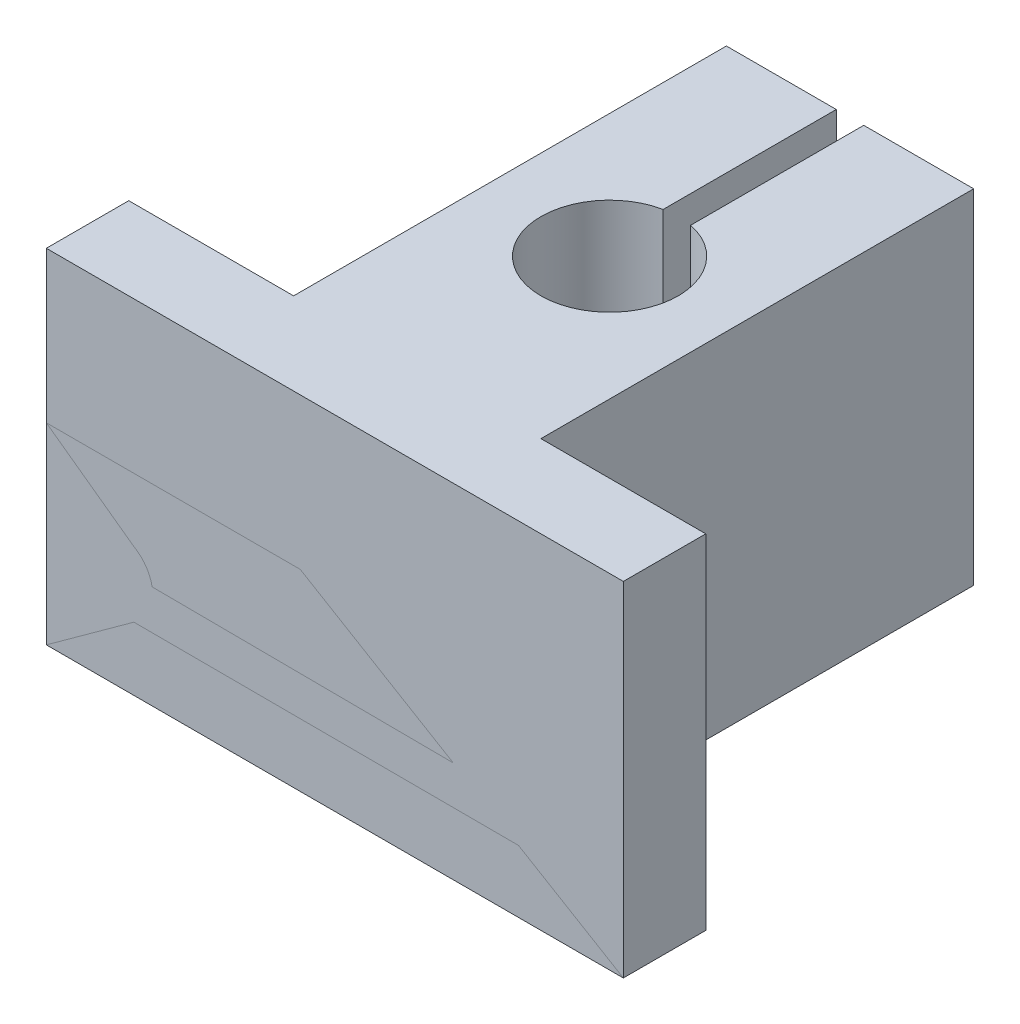
ISO-10303-21;
HEADER;
FILE_DESCRIPTION(('STEP AP214'),'2;1');
FILE_NAME('part.step','',(''),(''),'','','');
FILE_SCHEMA(('AUTOMOTIVE_DESIGN { 1 0 10303 214 1 1 1 1 }'));
ENDSEC;
DATA;
#1=APPLICATION_CONTEXT('core data for automotive mechanical design processes');
#2=APPLICATION_PROTOCOL_DEFINITION('international standard','automotive_design',2000,#1);
#3=PRODUCT_CONTEXT('',#1,'mechanical');
#4=PRODUCT('Part','Part','',(#3));
#5=PRODUCT_RELATED_PRODUCT_CATEGORY('part','',(#4));
#6=PRODUCT_DEFINITION_FORMATION('','',#4);
#7=PRODUCT_DEFINITION_CONTEXT('part definition',#1,'design');
#8=PRODUCT_DEFINITION('design','',#6,#7);
#9=PRODUCT_DEFINITION_SHAPE('','',#8);
#10=(LENGTH_UNIT() NAMED_UNIT(*) SI_UNIT(.MILLI.,.METRE.));
#11=(NAMED_UNIT(*) PLANE_ANGLE_UNIT() SI_UNIT($,.RADIAN.));
#12=(NAMED_UNIT(*) SI_UNIT($,.STERADIAN.) SOLID_ANGLE_UNIT());
#13=UNCERTAINTY_MEASURE_WITH_UNIT(LENGTH_MEASURE(1.E-05),#10,'distance_accuracy_value','');
#14=(GEOMETRIC_REPRESENTATION_CONTEXT(3) GLOBAL_UNCERTAINTY_ASSIGNED_CONTEXT((#13)) GLOBAL_UNIT_ASSIGNED_CONTEXT((#10,
#11,#12)) REPRESENTATION_CONTEXT('',''));
#15=CARTESIAN_POINT('',(0.,0.,0.));
#16=DIRECTION('',(0.,0.,1.));
#17=DIRECTION('',(1.,0.,0.));
#18=AXIS2_PLACEMENT_3D('',#15,#16,#17);
#19=CARTESIAN_POINT('',(-21.,14.,6.));
#20=DIRECTION('',(1.,0.,0.));
#21=DIRECTION('',(0.,0.,-1.));
#22=AXIS2_PLACEMENT_3D('',#19,#20,#21);
#23=PLANE('',#22);
#24=DIRECTION('',(0.,0.,1.));
#25=VECTOR('',#24,1.);
#26=CARTESIAN_POINT('',(-21.,0.,6.));
#27=LINE('',#26,#25);
#28=CARTESIAN_POINT('',(-21.,0.,0.));
#29=VERTEX_POINT('',#28);
#30=CARTESIAN_POINT('',(-21.,0.,6.));
#31=VERTEX_POINT('',#30);
#32=EDGE_CURVE('E167',#29,#31,#27,.T.);
#33=ORIENTED_EDGE('',*,*,#32,.T.);
#34=DIRECTION('',(0.,-1.,0.));
#35=VECTOR('',#34,1.);
#36=CARTESIAN_POINT('',(-21.,14.,6.));
#37=LINE('',#36,#35);
#38=CARTESIAN_POINT('',(-21.,14.,6.));
#39=VERTEX_POINT('',#38);
#40=EDGE_CURVE('E12',#39,#31,#37,.T.);
#41=ORIENTED_EDGE('',*,*,#40,.F.);
#42=DIRECTION('',(0.,0.,1.));
#43=VECTOR('',#42,1.);
#44=CARTESIAN_POINT('',(-21.,14.,6.));
#45=LINE('',#44,#43);
#46=CARTESIAN_POINT('',(-21.,14.,0.));
#47=VERTEX_POINT('',#46);
#48=EDGE_CURVE('E190',#47,#39,#45,.T.);
#49=ORIENTED_EDGE('',*,*,#48,.F.);
#50=DIRECTION('',(0.,-1.,0.));
#51=VECTOR('',#50,1.);
#52=CARTESIAN_POINT('',(-21.,14.,0.));
#53=LINE('',#52,#51);
#54=EDGE_CURVE('E163',#47,#29,#53,.T.);
#55=ORIENTED_EDGE('',*,*,#54,.T.);
#56=EDGE_LOOP('',(#33,#41,#49,#55));
#57=FACE_BOUND('',#56,.T.);
#58=ADVANCED_FACE('F47',(#57),#23,.F.);
#59=CARTESIAN_POINT('',(21.,14.,6.));
#60=DIRECTION('',(0.,0.,-1.));
#61=DIRECTION('',(-1.,0.,0.));
#62=AXIS2_PLACEMENT_3D('',#59,#60,#61);
#63=PLANE('',#62);
#64=CARTESIAN_POINT('',(-16.,7.,6.));
#65=DIRECTION('',(0.,0.,-1.));
#66=DIRECTION('',(-1.,0.,0.));
#67=AXIS2_PLACEMENT_3D('',#64,#65,#66);
#68=CIRCLE('',#67,2.75);
#69=CARTESIAN_POINT('',(-18.75,7.,6.));
#70=VERTEX_POINT('',#69);
#71=EDGE_CURVE('E435',#70,#70,#68,.T.);
#72=ORIENTED_EDGE('',*,*,#71,.T.);
#73=EDGE_LOOP('',(#72));
#74=FACE_BOUND('',#73,.T.);
#75=CARTESIAN_POINT('',(16.,7.,6.));
#76=DIRECTION('',(0.,0.,-1.));
#77=DIRECTION('',(-1.,0.,0.));
#78=AXIS2_PLACEMENT_3D('',#75,#76,#77);
#79=CIRCLE('',#78,2.75);
#80=CARTESIAN_POINT('',(13.25,7.,6.));
#81=VERTEX_POINT('',#80);
#82=EDGE_CURVE('E171',#81,#81,#79,.T.);
#83=ORIENTED_EDGE('',*,*,#82,.T.);
#84=EDGE_LOOP('',(#83));
#85=FACE_BOUND('',#84,.T.);
#86=DIRECTION('',(1.,0.,0.));
#87=VECTOR('',#86,1.);
#88=CARTESIAN_POINT('',(21.,0.,6.));
#89=LINE('',#88,#87);
#90=CARTESIAN_POINT('',(21.,0.,6.));
#91=VERTEX_POINT('',#90);
#92=EDGE_CURVE('E170',#31,#91,#89,.T.);
#93=ORIENTED_EDGE('',*,*,#92,.T.);
#94=DIRECTION('',(0.,-1.,0.));
#95=VECTOR('',#94,1.);
#96=CARTESIAN_POINT('',(21.,14.,6.));
#97=LINE('',#96,#95);
#98=CARTESIAN_POINT('',(21.,14.,6.));
#99=VERTEX_POINT('',#98);
#100=EDGE_CURVE('E55',#99,#91,#97,.T.);
#101=ORIENTED_EDGE('',*,*,#100,.F.);
#102=DIRECTION('',(1.,0.,0.));
#103=VECTOR('',#102,1.);
#104=CARTESIAN_POINT('',(21.,14.,6.));
#105=LINE('',#104,#103);
#106=EDGE_CURVE('E118',#39,#99,#105,.T.);
#107=ORIENTED_EDGE('',*,*,#106,.F.);
#108=ORIENTED_EDGE('',*,*,#40,.T.);
#109=EDGE_LOOP('',(#93,#101,#107,#108));
#110=FACE_BOUND('',#109,.T.);
#111=ADVANCED_FACE('F271',(#74,#85,#110),#63,.F.);
#112=CARTESIAN_POINT('',(21.,14.,0.));
#113=DIRECTION('',(-1.,0.,0.));
#114=DIRECTION('',(0.,0.,1.));
#115=AXIS2_PLACEMENT_3D('',#112,#113,#114);
#116=PLANE('',#115);
#117=DIRECTION('',(0.,0.,-1.));
#118=VECTOR('',#117,1.);
#119=CARTESIAN_POINT('',(21.,0.,0.));
#120=LINE('',#119,#118);
#121=CARTESIAN_POINT('',(21.,0.,0.));
#122=VERTEX_POINT('',#121);
#123=EDGE_CURVE('E173',#91,#122,#120,.T.);
#124=ORIENTED_EDGE('',*,*,#123,.T.);
#125=DIRECTION('',(0.,-1.,0.));
#126=VECTOR('',#125,1.);
#127=CARTESIAN_POINT('',(21.,14.,0.));
#128=LINE('',#127,#126);
#129=CARTESIAN_POINT('',(21.,14.,0.));
#130=VERTEX_POINT('',#129);
#131=EDGE_CURVE('E209',#130,#122,#128,.T.);
#132=ORIENTED_EDGE('',*,*,#131,.F.);
#133=DIRECTION('',(0.,0.,-1.));
#134=VECTOR('',#133,1.);
#135=CARTESIAN_POINT('',(21.,14.,0.));
#136=LINE('',#135,#134);
#137=EDGE_CURVE('E217',#99,#130,#136,.T.);
#138=ORIENTED_EDGE('',*,*,#137,.F.);
#139=ORIENTED_EDGE('',*,*,#100,.T.);
#140=EDGE_LOOP('',(#124,#132,#138,#139));
#141=FACE_BOUND('',#140,.T.);
#142=ADVANCED_FACE('F215',(#141),#116,.F.);
#143=CARTESIAN_POINT('',(8.99999999999999,14.,0.));
#144=DIRECTION('',(0.,0.,1.));
#145=DIRECTION('',(1.,0.,0.));
#146=AXIS2_PLACEMENT_3D('',#143,#144,#145);
#147=PLANE('',#146);
#148=CARTESIAN_POINT('',(16.,7.,0.));
#149=DIRECTION('',(0.,0.,-1.));
#150=DIRECTION('',(-1.,0.,0.));
#151=AXIS2_PLACEMENT_3D('',#148,#149,#150);
#152=CIRCLE('',#151,2.75);
#153=CARTESIAN_POINT('',(13.25,7.,0.));
#154=VERTEX_POINT('',#153);
#155=EDGE_CURVE('E434',#154,#154,#152,.T.);
#156=ORIENTED_EDGE('',*,*,#155,.F.);
#157=EDGE_LOOP('',(#156));
#158=FACE_BOUND('',#157,.T.);
#159=DIRECTION('',(-1.,0.,0.));
#160=VECTOR('',#159,1.);
#161=CARTESIAN_POINT('',(8.99999999999999,0.,0.));
#162=LINE('',#161,#160);
#163=CARTESIAN_POINT('',(8.99999999999999,0.,0.));
#164=VERTEX_POINT('',#163);
#165=EDGE_CURVE('E175',#122,#164,#162,.T.);
#166=ORIENTED_EDGE('',*,*,#165,.T.);
#167=DIRECTION('',(0.,-1.,0.));
#168=VECTOR('',#167,1.);
#169=CARTESIAN_POINT('',(8.99999999999999,14.,0.));
#170=LINE('',#169,#168);
#171=CARTESIAN_POINT('',(8.99999999999999,14.,0.));
#172=VERTEX_POINT('',#171);
#173=EDGE_CURVE('E206',#172,#164,#170,.T.);
#174=ORIENTED_EDGE('',*,*,#173,.F.);
#175=DIRECTION('',(-1.,0.,0.));
#176=VECTOR('',#175,1.);
#177=CARTESIAN_POINT('',(8.99999999999999,14.,0.));
#178=LINE('',#177,#176);
#179=EDGE_CURVE('E235',#130,#172,#178,.T.);
#180=ORIENTED_EDGE('',*,*,#179,.F.);
#181=ORIENTED_EDGE('',*,*,#131,.T.);
#182=EDGE_LOOP('',(#166,#174,#180,#181));
#183=FACE_BOUND('',#182,.T.);
#184=ADVANCED_FACE('F226',(#158,#183),#147,.F.);
#185=CARTESIAN_POINT('',(9.,14.,-31.5));
#186=DIRECTION('',(-1.,0.,0.));
#187=DIRECTION('',(0.,0.,1.));
#188=AXIS2_PLACEMENT_3D('',#185,#186,#187);
#189=PLANE('',#188);
#190=CARTESIAN_POINT('',(9.,7.,-26.5));
#191=DIRECTION('',(-1.,0.,0.));
#192=DIRECTION('',(0.,0.,1.));
#193=AXIS2_PLACEMENT_3D('',#190,#191,#192);
#194=CIRCLE('',#193,2.);
#195=CARTESIAN_POINT('',(9.,7.,-24.5));
#196=VERTEX_POINT('',#195);
#197=EDGE_CURVE('E444',#196,#196,#194,.T.);
#198=ORIENTED_EDGE('',*,*,#197,.T.);
#199=EDGE_LOOP('',(#198));
#200=FACE_BOUND('',#199,.T.);
#201=DIRECTION('',(0.,0.,-1.));
#202=VECTOR('',#201,1.);
#203=CARTESIAN_POINT('',(9.,0.,-31.5));
#204=LINE('',#203,#202);
#205=CARTESIAN_POINT('',(9.,0.,-31.5));
#206=VERTEX_POINT('',#205);
#207=EDGE_CURVE('E177',#164,#206,#204,.T.);
#208=ORIENTED_EDGE('',*,*,#207,.T.);
#209=DIRECTION('',(0.,-1.,0.));
#210=VECTOR('',#209,1.);
#211=CARTESIAN_POINT('',(9.,14.,-31.5));
#212=LINE('',#211,#210);
#213=CARTESIAN_POINT('',(9.,14.,-31.5));
#214=VERTEX_POINT('',#213);
#215=EDGE_CURVE('E203',#214,#206,#212,.T.);
#216=ORIENTED_EDGE('',*,*,#215,.F.);
#217=DIRECTION('',(0.,0.,-1.));
#218=VECTOR('',#217,1.);
#219=CARTESIAN_POINT('',(9.,14.,-31.5));
#220=LINE('',#219,#218);
#221=EDGE_CURVE('E232',#172,#214,#220,.T.);
#222=ORIENTED_EDGE('',*,*,#221,.F.);
#223=ORIENTED_EDGE('',*,*,#173,.T.);
#224=EDGE_LOOP('',(#208,#216,#222,#223));
#225=FACE_BOUND('',#224,.T.);
#226=ADVANCED_FACE('F230',(#200,#225),#189,.F.);
#227=CARTESIAN_POINT('',(0.999999999999998,14.,-31.5));
#228=DIRECTION('',(0.,0.,1.));
#229=DIRECTION('',(1.,0.,0.));
#230=AXIS2_PLACEMENT_3D('',#227,#228,#229);
#231=PLANE('',#230);
#232=DIRECTION('',(-1.,0.,0.));
#233=VECTOR('',#232,1.);
#234=CARTESIAN_POINT('',(0.999999999999998,0.,-31.5));
#235=LINE('',#234,#233);
#236=CARTESIAN_POINT('',(0.999999999999998,0.,-31.5));
#237=VERTEX_POINT('',#236);
#238=EDGE_CURVE('E179',#206,#237,#235,.T.);
#239=ORIENTED_EDGE('',*,*,#238,.T.);
#240=DIRECTION('',(0.,-1.,0.));
#241=VECTOR('',#240,1.);
#242=CARTESIAN_POINT('',(0.999999999999998,14.,-31.5));
#243=LINE('',#242,#241);
#244=CARTESIAN_POINT('',(0.999999999999998,14.,-31.5));
#245=VERTEX_POINT('',#244);
#246=EDGE_CURVE('E200',#245,#237,#243,.T.);
#247=ORIENTED_EDGE('',*,*,#246,.F.);
#248=DIRECTION('',(-1.,0.,0.));
#249=VECTOR('',#248,1.);
#250=CARTESIAN_POINT('',(0.999999999999998,14.,-31.5));
#251=LINE('',#250,#249);
#252=EDGE_CURVE('E234',#214,#245,#251,.T.);
#253=ORIENTED_EDGE('',*,*,#252,.F.);
#254=ORIENTED_EDGE('',*,*,#215,.T.);
#255=EDGE_LOOP('',(#239,#247,#253,#254));
#256=FACE_BOUND('',#255,.T.);
#257=ADVANCED_FACE('F288',(#256),#231,.F.);
#258=CARTESIAN_POINT('',(0.999999999999998,14.,-31.5));
#259=DIRECTION('',(1.,0.,0.));
#260=DIRECTION('',(0.,0.,-1.));
#261=AXIS2_PLACEMENT_3D('',#258,#259,#260);
#262=PLANE('',#261);
#263=CARTESIAN_POINT('',(0.999999999999997,7.,-26.5));
#264=DIRECTION('',(1.,0.,0.));
#265=DIRECTION('',(0.,0.,-1.));
#266=AXIS2_PLACEMENT_3D('',#263,#264,#265);
#267=CIRCLE('',#266,2.);
#268=CARTESIAN_POINT('',(0.999999999999997,7.,-28.5));
#269=VERTEX_POINT('',#268);
#270=EDGE_CURVE('E448',#269,#269,#267,.T.);
#271=ORIENTED_EDGE('',*,*,#270,.T.);
#272=EDGE_LOOP('',(#271));
#273=FACE_BOUND('',#272,.T.);
#274=DIRECTION('',(0.,0.,1.));
#275=VECTOR('',#274,1.);
#276=CARTESIAN_POINT('',(0.999999999999998,0.,-31.5));
#277=LINE('',#276,#275);
#278=CARTESIAN_POINT('',(1.,0.,-18.8989794855664));
#279=VERTEX_POINT('',#278);
#280=EDGE_CURVE('E181',#237,#279,#277,.T.);
#281=ORIENTED_EDGE('',*,*,#280,.T.);
#282=DIRECTION('',(0.,-1.,0.));
#283=VECTOR('',#282,1.);
#284=CARTESIAN_POINT('',(1.,14.,-18.8989794855664));
#285=LINE('',#284,#283);
#286=CARTESIAN_POINT('',(1.,14.,-18.8989794855664));
#287=VERTEX_POINT('',#286);
#288=EDGE_CURVE('E197',#287,#279,#285,.T.);
#289=ORIENTED_EDGE('',*,*,#288,.F.);
#290=DIRECTION('',(0.,0.,1.));
#291=VECTOR('',#290,1.);
#292=CARTESIAN_POINT('',(0.999999999999998,14.,-31.5));
#293=LINE('',#292,#291);
#294=EDGE_CURVE('E237',#245,#287,#293,.T.);
#295=ORIENTED_EDGE('',*,*,#294,.F.);
#296=ORIENTED_EDGE('',*,*,#246,.T.);
#297=EDGE_LOOP('',(#281,#289,#295,#296));
#298=FACE_BOUND('',#297,.T.);
#299=ADVANCED_FACE('F292',(#273,#298),#262,.F.);
#300=CARTESIAN_POINT('',(0.,14.,-14.));
#301=DIRECTION('',(0.,-1.,0.));
#302=DIRECTION('',(0.,0.,-1.));
#303=AXIS2_PLACEMENT_3D('',#300,#301,#302);
#304=CYLINDRICAL_SURFACE('',#303,5.);
#305=CARTESIAN_POINT('',(0.,0.,-14.));
#306=DIRECTION('',(0.,-1.,0.));
#307=DIRECTION('',(0.,0.,1.));
#308=AXIS2_PLACEMENT_3D('',#305,#306,#307);
#309=CIRCLE('',#308,5.);
#310=CARTESIAN_POINT('',(-1.,0.,-18.8989794855664));
#311=VERTEX_POINT('',#310);
#312=EDGE_CURVE('E183',#279,#311,#309,.T.);
#313=ORIENTED_EDGE('',*,*,#312,.T.);
#314=DIRECTION('',(0.,-1.,0.));
#315=VECTOR('',#314,1.);
#316=CARTESIAN_POINT('',(-1.,14.,-18.8989794855664));
#317=LINE('',#316,#315);
#318=CARTESIAN_POINT('',(-1.,14.,-18.8989794855664));
#319=VERTEX_POINT('',#318);
#320=EDGE_CURVE('E194',#319,#311,#317,.T.);
#321=ORIENTED_EDGE('',*,*,#320,.F.);
#322=CARTESIAN_POINT('',(0.,14.,-14.));
#323=DIRECTION('',(0.,-1.,0.));
#324=DIRECTION('',(0.,0.,1.));
#325=AXIS2_PLACEMENT_3D('',#322,#323,#324);
#326=CIRCLE('',#325,5.);
#327=EDGE_CURVE('E243',#287,#319,#326,.T.);
#328=ORIENTED_EDGE('',*,*,#327,.F.);
#329=ORIENTED_EDGE('',*,*,#288,.T.);
#330=EDGE_LOOP('',(#313,#321,#328,#329));
#331=FACE_BOUND('',#330,.T.);
#332=ADVANCED_FACE('F249',(#331),#304,.F.);
#333=CARTESIAN_POINT('',(-0.999999999999998,14.,-31.5));
#334=DIRECTION('',(-1.,0.,0.));
#335=DIRECTION('',(0.,0.,1.));
#336=AXIS2_PLACEMENT_3D('',#333,#334,#335);
#337=PLANE('',#336);
#338=CARTESIAN_POINT('',(-0.999999999999997,7.,-26.5));
#339=DIRECTION('',(-1.,0.,0.));
#340=DIRECTION('',(0.,0.,1.));
#341=AXIS2_PLACEMENT_3D('',#338,#339,#340);
#342=CIRCLE('',#341,2.);
#343=CARTESIAN_POINT('',(-0.999999999999998,7.,-24.5));
#344=VERTEX_POINT('',#343);
#345=EDGE_CURVE('E451',#344,#344,#342,.T.);
#346=ORIENTED_EDGE('',*,*,#345,.T.);
#347=EDGE_LOOP('',(#346));
#348=FACE_BOUND('',#347,.T.);
#349=DIRECTION('',(0.,0.,-1.));
#350=VECTOR('',#349,1.);
#351=CARTESIAN_POINT('',(-0.999999999999998,0.,-31.5));
#352=LINE('',#351,#350);
#353=CARTESIAN_POINT('',(-0.999999999999998,0.,-31.5));
#354=VERTEX_POINT('',#353);
#355=EDGE_CURVE('E185',#311,#354,#352,.T.);
#356=ORIENTED_EDGE('',*,*,#355,.T.);
#357=DIRECTION('',(0.,-1.,0.));
#358=VECTOR('',#357,1.);
#359=CARTESIAN_POINT('',(-0.999999999999998,14.,-31.5));
#360=LINE('',#359,#358);
#361=CARTESIAN_POINT('',(-0.999999999999998,14.,-31.5));
#362=VERTEX_POINT('',#361);
#363=EDGE_CURVE('E158',#362,#354,#360,.T.);
#364=ORIENTED_EDGE('',*,*,#363,.F.);
#365=DIRECTION('',(0.,0.,-1.));
#366=VECTOR('',#365,1.);
#367=CARTESIAN_POINT('',(-0.999999999999998,14.,-31.5));
#368=LINE('',#367,#366);
#369=EDGE_CURVE('E149',#319,#362,#368,.T.);
#370=ORIENTED_EDGE('',*,*,#369,.F.);
#371=ORIENTED_EDGE('',*,*,#320,.T.);
#372=EDGE_LOOP('',(#356,#364,#370,#371));
#373=FACE_BOUND('',#372,.T.);
#374=ADVANCED_FACE('F253',(#348,#373),#337,.F.);
#375=CARTESIAN_POINT('',(-9.,14.,-31.5));
#376=DIRECTION('',(0.,0.,1.));
#377=DIRECTION('',(1.,0.,0.));
#378=AXIS2_PLACEMENT_3D('',#375,#376,#377);
#379=PLANE('',#378);
#380=DIRECTION('',(-1.,0.,0.));
#381=VECTOR('',#380,1.);
#382=CARTESIAN_POINT('',(-9.,0.,-31.5));
#383=LINE('',#382,#381);
#384=CARTESIAN_POINT('',(-9.,0.,-31.5));
#385=VERTEX_POINT('',#384);
#386=EDGE_CURVE('E157',#354,#385,#383,.T.);
#387=ORIENTED_EDGE('',*,*,#386,.T.);
#388=DIRECTION('',(0.,-1.,0.));
#389=VECTOR('',#388,1.);
#390=CARTESIAN_POINT('',(-9.,14.,-31.5));
#391=LINE('',#390,#389);
#392=CARTESIAN_POINT('',(-9.,14.,-31.5));
#393=VERTEX_POINT('',#392);
#394=EDGE_CURVE('E154',#393,#385,#391,.T.);
#395=ORIENTED_EDGE('',*,*,#394,.F.);
#396=DIRECTION('',(-1.,0.,0.));
#397=VECTOR('',#396,1.);
#398=CARTESIAN_POINT('',(-9.,14.,-31.5));
#399=LINE('',#398,#397);
#400=EDGE_CURVE('E143',#362,#393,#399,.T.);
#401=ORIENTED_EDGE('',*,*,#400,.F.);
#402=ORIENTED_EDGE('',*,*,#363,.T.);
#403=EDGE_LOOP('',(#387,#395,#401,#402));
#404=FACE_BOUND('',#403,.T.);
#405=ADVANCED_FACE('F155',(#404),#379,.F.);
#406=CARTESIAN_POINT('',(-9.,14.,-31.5));
#407=DIRECTION('',(1.,0.,0.));
#408=DIRECTION('',(0.,0.,-1.));
#409=AXIS2_PLACEMENT_3D('',#406,#407,#408);
#410=PLANE('',#409);
#411=CARTESIAN_POINT('',(-9.,7.,-26.5));
#412=DIRECTION('',(-1.,0.,0.));
#413=DIRECTION('',(0.,0.,1.));
#414=AXIS2_PLACEMENT_3D('',#411,#412,#413);
#415=CIRCLE('',#414,2.);
#416=CARTESIAN_POINT('',(-9.,7.,-24.5));
#417=VERTEX_POINT('',#416);
#418=EDGE_CURVE('E454',#417,#417,#415,.T.);
#419=ORIENTED_EDGE('',*,*,#418,.F.);
#420=EDGE_LOOP('',(#419));
#421=FACE_BOUND('',#420,.T.);
#422=DIRECTION('',(0.,0.,1.));
#423=VECTOR('',#422,1.);
#424=CARTESIAN_POINT('',(-9.,0.,-31.5));
#425=LINE('',#424,#423);
#426=CARTESIAN_POINT('',(-8.99999999999999,0.,0.));
#427=VERTEX_POINT('',#426);
#428=EDGE_CURVE('E104',#385,#427,#425,.T.);
#429=ORIENTED_EDGE('',*,*,#428,.T.);
#430=DIRECTION('',(0.,-1.,0.));
#431=VECTOR('',#430,1.);
#432=CARTESIAN_POINT('',(-8.99999999999999,14.,0.));
#433=LINE('',#432,#431);
#434=CARTESIAN_POINT('',(-8.99999999999999,14.,0.));
#435=VERTEX_POINT('',#434);
#436=EDGE_CURVE('E159',#435,#427,#433,.T.);
#437=ORIENTED_EDGE('',*,*,#436,.F.);
#438=DIRECTION('',(0.,0.,1.));
#439=VECTOR('',#438,1.);
#440=CARTESIAN_POINT('',(-9.,14.,-31.5));
#441=LINE('',#440,#439);
#442=EDGE_CURVE('E147',#393,#435,#441,.T.);
#443=ORIENTED_EDGE('',*,*,#442,.F.);
#444=ORIENTED_EDGE('',*,*,#394,.T.);
#445=EDGE_LOOP('',(#429,#437,#443,#444));
#446=FACE_BOUND('',#445,.T.);
#447=ADVANCED_FACE('F161',(#421,#446),#410,.F.);
#448=CARTESIAN_POINT('',(-21.,14.,0.));
#449=DIRECTION('',(0.,0.,1.));
#450=DIRECTION('',(1.,0.,0.));
#451=AXIS2_PLACEMENT_3D('',#448,#449,#450);
#452=PLANE('',#451);
#453=CARTESIAN_POINT('',(-16.,7.,0.));
#454=DIRECTION('',(0.,0.,-1.));
#455=DIRECTION('',(-1.,0.,0.));
#456=AXIS2_PLACEMENT_3D('',#453,#454,#455);
#457=CIRCLE('',#456,2.75);
#458=CARTESIAN_POINT('',(-18.75,7.,0.));
#459=VERTEX_POINT('',#458);
#460=EDGE_CURVE('E438',#459,#459,#457,.T.);
#461=ORIENTED_EDGE('',*,*,#460,.F.);
#462=EDGE_LOOP('',(#461));
#463=FACE_BOUND('',#462,.T.);
#464=DIRECTION('',(-1.,0.,0.));
#465=VECTOR('',#464,1.);
#466=CARTESIAN_POINT('',(-21.,0.,0.));
#467=LINE('',#466,#465);
#468=EDGE_CURVE('E110',#427,#29,#467,.T.);
#469=ORIENTED_EDGE('',*,*,#468,.T.);
#470=ORIENTED_EDGE('',*,*,#54,.F.);
#471=DIRECTION('',(-1.,0.,0.));
#472=VECTOR('',#471,1.);
#473=CARTESIAN_POINT('',(-21.,14.,0.));
#474=LINE('',#473,#472);
#475=EDGE_CURVE('E63',#435,#47,#474,.T.);
#476=ORIENTED_EDGE('',*,*,#475,.F.);
#477=ORIENTED_EDGE('',*,*,#436,.T.);
#478=EDGE_LOOP('',(#469,#470,#476,#477));
#479=FACE_BOUND('',#478,.T.);
#480=ADVANCED_FACE('F257',(#463,#479),#452,.F.);
#481=CARTESIAN_POINT('',(0.,14.,-14.));
#482=DIRECTION('',(0.,1.,0.));
#483=DIRECTION('',(0.,0.,1.));
#484=AXIS2_PLACEMENT_3D('',#481,#482,#483);
#485=PLANE('',#484);
#486=ORIENTED_EDGE('',*,*,#48,.T.);
#487=ORIENTED_EDGE('',*,*,#106,.T.);
#488=ORIENTED_EDGE('',*,*,#137,.T.);
#489=ORIENTED_EDGE('',*,*,#179,.T.);
#490=ORIENTED_EDGE('',*,*,#221,.T.);
#491=ORIENTED_EDGE('',*,*,#252,.T.);
#492=ORIENTED_EDGE('',*,*,#294,.T.);
#493=ORIENTED_EDGE('',*,*,#327,.T.);
#494=ORIENTED_EDGE('',*,*,#369,.T.);
#495=ORIENTED_EDGE('',*,*,#400,.T.);
#496=ORIENTED_EDGE('',*,*,#442,.T.);
#497=ORIENTED_EDGE('',*,*,#475,.T.);
#498=EDGE_LOOP('',(#486,#487,#488,#489,#490,#491,#492,#493,#494,#495,#496,#497));
#499=FACE_BOUND('',#498,.T.);
#500=ADVANCED_FACE('F145',(#499),#485,.T.);
#501=CARTESIAN_POINT('',(0.,0.,-14.));
#502=DIRECTION('',(0.,1.,0.));
#503=DIRECTION('',(0.,0.,1.));
#504=AXIS2_PLACEMENT_3D('',#501,#502,#503);
#505=PLANE('',#504);
#506=ORIENTED_EDGE('',*,*,#32,.F.);
#507=ORIENTED_EDGE('',*,*,#468,.F.);
#508=ORIENTED_EDGE('',*,*,#428,.F.);
#509=ORIENTED_EDGE('',*,*,#386,.F.);
#510=ORIENTED_EDGE('',*,*,#355,.F.);
#511=ORIENTED_EDGE('',*,*,#312,.F.);
#512=ORIENTED_EDGE('',*,*,#280,.F.);
#513=ORIENTED_EDGE('',*,*,#238,.F.);
#514=ORIENTED_EDGE('',*,*,#207,.F.);
#515=ORIENTED_EDGE('',*,*,#165,.F.);
#516=ORIENTED_EDGE('',*,*,#123,.F.);
#517=ORIENTED_EDGE('',*,*,#92,.F.);
#518=EDGE_LOOP('',(#506,#507,#508,#509,#510,#511,#512,#513,#514,#515,#516,#517));
#519=FACE_BOUND('',#518,.T.);
#520=ADVANCED_FACE('F221',(#519),#505,.F.);
#521=CARTESIAN_POINT('',(16.,7.,6.));
#522=DIRECTION('',(0.,0.,-1.));
#523=DIRECTION('',(-1.,0.,0.));
#524=AXIS2_PLACEMENT_3D('',#521,#522,#523);
#525=CYLINDRICAL_SURFACE('',#524,2.75);
#526=ORIENTED_EDGE('',*,*,#82,.F.);
#527=EDGE_LOOP('',(#526));
#528=FACE_BOUND('',#527,.T.);
#529=ORIENTED_EDGE('',*,*,#155,.T.);
#530=EDGE_LOOP('',(#529));
#531=FACE_BOUND('',#530,.T.);
#532=ADVANCED_FACE('F347',(#528,#531),#525,.F.);
#533=CARTESIAN_POINT('',(-16.,7.,6.));
#534=DIRECTION('',(0.,0.,-1.));
#535=DIRECTION('',(-1.,0.,0.));
#536=AXIS2_PLACEMENT_3D('',#533,#534,#535);
#537=CYLINDRICAL_SURFACE('',#536,2.75);
#538=ORIENTED_EDGE('',*,*,#71,.F.);
#539=EDGE_LOOP('',(#538));
#540=FACE_BOUND('',#539,.T.);
#541=ORIENTED_EDGE('',*,*,#460,.T.);
#542=EDGE_LOOP('',(#541));
#543=FACE_BOUND('',#542,.T.);
#544=ADVANCED_FACE('F328',(#540,#543),#537,.F.);
#545=CARTESIAN_POINT('',(21.,7.,-26.5));
#546=DIRECTION('',(-1.,0.,0.));
#547=DIRECTION('',(0.,0.,1.));
#548=AXIS2_PLACEMENT_3D('',#545,#546,#547);
#549=CYLINDRICAL_SURFACE('',#548,2.);
#550=ORIENTED_EDGE('',*,*,#418,.T.);
#551=EDGE_LOOP('',(#550));
#552=FACE_BOUND('',#551,.T.);
#553=ORIENTED_EDGE('',*,*,#345,.F.);
#554=EDGE_LOOP('',(#553));
#555=FACE_BOUND('',#554,.T.);
#556=ADVANCED_FACE('F322',(#552,#555),#549,.F.);
#557=ORIENTED_EDGE('',*,*,#270,.F.);
#558=EDGE_LOOP('',(#557));
#559=FACE_BOUND('',#558,.T.);
#560=ORIENTED_EDGE('',*,*,#197,.F.);
#561=EDGE_LOOP('',(#560));
#562=FACE_BOUND('',#561,.T.);
#563=ADVANCED_FACE('F327',(#559,#562),#549,.F.);
#564=CLOSED_SHELL('',(#58,#111,#142,#184,#226,#257,#299,#332,#374,#405,#447,#480,#500,#520,#532,
#544,#556,#563));
#565=MANIFOLD_SOLID_BREP('B2',#564);
#566=CARTESIAN_POINT('',(-21.,25.,6.));
#567=DIRECTION('',(1.,0.,0.));
#568=DIRECTION('',(0.,0.,-1.));
#569=AXIS2_PLACEMENT_3D('',#566,#567,#568);
#570=PLANE('',#569);
#571=DIRECTION('',(0.,0.,1.));
#572=VECTOR('',#571,1.);
#573=CARTESIAN_POINT('',(-21.,0.,6.));
#574=LINE('',#573,#572);
#575=CARTESIAN_POINT('',(-21.,0.,0.));
#576=VERTEX_POINT('',#575);
#577=CARTESIAN_POINT('',(-21.,0.,6.));
#578=VERTEX_POINT('',#577);
#579=EDGE_CURVE('E588',#576,#578,#574,.T.);
#580=ORIENTED_EDGE('',*,*,#579,.T.);
#581=DIRECTION('',(0.,-1.,0.));
#582=VECTOR('',#581,1.);
#583=CARTESIAN_POINT('',(-21.,25.,6.));
#584=LINE('',#583,#582);
#585=CARTESIAN_POINT('',(-21.,25.,6.));
#586=VERTEX_POINT('',#585);
#587=EDGE_CURVE('E45',#586,#578,#584,.T.);
#588=ORIENTED_EDGE('',*,*,#587,.F.);
#589=DIRECTION('',(0.,0.,1.));
#590=VECTOR('',#589,1.);
#591=CARTESIAN_POINT('',(-21.,25.,6.));
#592=LINE('',#591,#590);
#593=CARTESIAN_POINT('',(-21.,25.,0.));
#594=VERTEX_POINT('',#593);
#595=EDGE_CURVE('E610',#594,#586,#592,.T.);
#596=ORIENTED_EDGE('',*,*,#595,.F.);
#597=DIRECTION('',(0.,-1.,0.));
#598=VECTOR('',#597,1.);
#599=CARTESIAN_POINT('',(-21.,25.,0.));
#600=LINE('',#599,#598);
#601=EDGE_CURVE('E584',#594,#576,#600,.T.);
#602=ORIENTED_EDGE('',*,*,#601,.T.);
#603=EDGE_LOOP('',(#580,#588,#596,#602));
#604=FACE_BOUND('',#603,.T.);
#605=ADVANCED_FACE('F468',(#604),#570,.F.);
#606=CARTESIAN_POINT('',(21.,25.,6.));
#607=DIRECTION('',(0.,0.,-1.));
#608=DIRECTION('',(-1.,0.,0.));
#609=AXIS2_PLACEMENT_3D('',#606,#607,#608);
#610=PLANE('',#609);
#611=DIRECTION('',(1.,0.,0.));
#612=VECTOR('',#611,1.);
#613=CARTESIAN_POINT('',(21.,0.,6.));
#614=LINE('',#613,#612);
#615=CARTESIAN_POINT('',(21.,0.,6.));
#616=VERTEX_POINT('',#615);
#617=EDGE_CURVE('E591',#578,#616,#614,.T.);
#618=ORIENTED_EDGE('',*,*,#617,.T.);
#619=DIRECTION('',(0.,-1.,0.));
#620=VECTOR('',#619,1.);
#621=CARTESIAN_POINT('',(21.,25.,6.));
#622=LINE('',#621,#620);
#623=CARTESIAN_POINT('',(21.,25.,6.));
#624=VERTEX_POINT('',#623);
#625=EDGE_CURVE('E476',#624,#616,#622,.T.);
#626=ORIENTED_EDGE('',*,*,#625,.F.);
#627=DIRECTION('',(1.,0.,0.));
#628=VECTOR('',#627,1.);
#629=CARTESIAN_POINT('',(21.,25.,6.));
#630=LINE('',#629,#628);
#631=EDGE_CURVE('E539',#586,#624,#630,.T.);
#632=ORIENTED_EDGE('',*,*,#631,.F.);
#633=ORIENTED_EDGE('',*,*,#587,.T.);
#634=EDGE_LOOP('',(#618,#626,#632,#633));
#635=FACE_BOUND('',#634,.T.);
#636=ADVANCED_FACE('F688',(#635),#610,.F.);
#637=CARTESIAN_POINT('',(21.,25.,0.));
#638=DIRECTION('',(-1.,0.,0.));
#639=DIRECTION('',(0.,0.,1.));
#640=AXIS2_PLACEMENT_3D('',#637,#638,#639);
#641=PLANE('',#640);
#642=DIRECTION('',(0.,0.,-1.));
#643=VECTOR('',#642,1.);
#644=CARTESIAN_POINT('',(21.,0.,0.));
#645=LINE('',#644,#643);
#646=CARTESIAN_POINT('',(21.,0.,0.));
#647=VERTEX_POINT('',#646);
#648=EDGE_CURVE('E593',#616,#647,#645,.T.);
#649=ORIENTED_EDGE('',*,*,#648,.T.);
#650=DIRECTION('',(0.,-1.,0.));
#651=VECTOR('',#650,1.);
#652=CARTESIAN_POINT('',(21.,25.,0.));
#653=LINE('',#652,#651);
#654=CARTESIAN_POINT('',(21.,25.,0.));
#655=VERTEX_POINT('',#654);
#656=EDGE_CURVE('E629',#655,#647,#653,.T.);
#657=ORIENTED_EDGE('',*,*,#656,.F.);
#658=DIRECTION('',(0.,0.,-1.));
#659=VECTOR('',#658,1.);
#660=CARTESIAN_POINT('',(21.,25.,0.));
#661=LINE('',#660,#659);
#662=EDGE_CURVE('E637',#624,#655,#661,.T.);
#663=ORIENTED_EDGE('',*,*,#662,.F.);
#664=ORIENTED_EDGE('',*,*,#625,.T.);
#665=EDGE_LOOP('',(#649,#657,#663,#664));
#666=FACE_BOUND('',#665,.T.);
#667=ADVANCED_FACE('F635',(#666),#641,.F.);
#668=CARTESIAN_POINT('',(8.99999999999999,25.,0.));
#669=DIRECTION('',(0.,0.,1.));
#670=DIRECTION('',(1.,0.,0.));
#671=AXIS2_PLACEMENT_3D('',#668,#669,#670);
#672=PLANE('',#671);
#673=DIRECTION('',(-1.,0.,0.));
#674=VECTOR('',#673,1.);
#675=CARTESIAN_POINT('',(8.99999999999999,0.,0.));
#676=LINE('',#675,#674);
#677=CARTESIAN_POINT('',(8.99999999999999,0.,0.));
#678=VERTEX_POINT('',#677);
#679=EDGE_CURVE('E595',#647,#678,#676,.T.);
#680=ORIENTED_EDGE('',*,*,#679,.T.);
#681=DIRECTION('',(0.,-1.,0.));
#682=VECTOR('',#681,1.);
#683=CARTESIAN_POINT('',(8.99999999999999,25.,0.));
#684=LINE('',#683,#682);
#685=CARTESIAN_POINT('',(8.99999999999999,25.,0.));
#686=VERTEX_POINT('',#685);
#687=EDGE_CURVE('E626',#686,#678,#684,.T.);
#688=ORIENTED_EDGE('',*,*,#687,.F.);
#689=DIRECTION('',(-1.,0.,0.));
#690=VECTOR('',#689,1.);
#691=CARTESIAN_POINT('',(8.99999999999999,25.,0.));
#692=LINE('',#691,#690);
#693=EDGE_CURVE('E655',#655,#686,#692,.T.);
#694=ORIENTED_EDGE('',*,*,#693,.F.);
#695=ORIENTED_EDGE('',*,*,#656,.T.);
#696=EDGE_LOOP('',(#680,#688,#694,#695));
#697=FACE_BOUND('',#696,.T.);
#698=ADVANCED_FACE('F646',(#697),#672,.F.);
#699=CARTESIAN_POINT('',(9.,25.,-31.5));
#700=DIRECTION('',(-1.,0.,0.));
#701=DIRECTION('',(0.,0.,1.));
#702=AXIS2_PLACEMENT_3D('',#699,#700,#701);
#703=PLANE('',#702);
#704=DIRECTION('',(0.,0.,-1.));
#705=VECTOR('',#704,1.);
#706=CARTESIAN_POINT('',(9.,0.,-31.5));
#707=LINE('',#706,#705);
#708=CARTESIAN_POINT('',(9.,0.,-31.5));
#709=VERTEX_POINT('',#708);
#710=EDGE_CURVE('E597',#678,#709,#707,.T.);
#711=ORIENTED_EDGE('',*,*,#710,.T.);
#712=DIRECTION('',(0.,-1.,0.));
#713=VECTOR('',#712,1.);
#714=CARTESIAN_POINT('',(9.,25.,-31.5));
#715=LINE('',#714,#713);
#716=CARTESIAN_POINT('',(9.,25.,-31.5));
#717=VERTEX_POINT('',#716);
#718=EDGE_CURVE('E623',#717,#709,#715,.T.);
#719=ORIENTED_EDGE('',*,*,#718,.F.);
#720=DIRECTION('',(0.,0.,-1.));
#721=VECTOR('',#720,1.);
#722=CARTESIAN_POINT('',(9.,25.,-31.5));
#723=LINE('',#722,#721);
#724=EDGE_CURVE('E652',#686,#717,#723,.T.);
#725=ORIENTED_EDGE('',*,*,#724,.F.);
#726=ORIENTED_EDGE('',*,*,#687,.T.);
#727=EDGE_LOOP('',(#711,#719,#725,#726));
#728=FACE_BOUND('',#727,.T.);
#729=ADVANCED_FACE('F650',(#728),#703,.F.);
#730=CARTESIAN_POINT('',(0.999999999999998,25.,-31.5));
#731=DIRECTION('',(0.,0.,1.));
#732=DIRECTION('',(1.,0.,0.));
#733=AXIS2_PLACEMENT_3D('',#730,#731,#732);
#734=PLANE('',#733);
#735=DIRECTION('',(-1.,0.,0.));
#736=VECTOR('',#735,1.);
#737=CARTESIAN_POINT('',(0.999999999999998,0.,-31.5));
#738=LINE('',#737,#736);
#739=CARTESIAN_POINT('',(0.999999999999998,0.,-31.5));
#740=VERTEX_POINT('',#739);
#741=EDGE_CURVE('E599',#709,#740,#738,.T.);
#742=ORIENTED_EDGE('',*,*,#741,.T.);
#743=DIRECTION('',(0.,-1.,0.));
#744=VECTOR('',#743,1.);
#745=CARTESIAN_POINT('',(0.999999999999998,25.,-31.5));
#746=LINE('',#745,#744);
#747=CARTESIAN_POINT('',(0.999999999999998,25.,-31.5));
#748=VERTEX_POINT('',#747);
#749=EDGE_CURVE('E620',#748,#740,#746,.T.);
#750=ORIENTED_EDGE('',*,*,#749,.F.);
#751=DIRECTION('',(-1.,0.,0.));
#752=VECTOR('',#751,1.);
#753=CARTESIAN_POINT('',(0.999999999999998,25.,-31.5));
#754=LINE('',#753,#752);
#755=EDGE_CURVE('E654',#717,#748,#754,.T.);
#756=ORIENTED_EDGE('',*,*,#755,.F.);
#757=ORIENTED_EDGE('',*,*,#718,.T.);
#758=EDGE_LOOP('',(#742,#750,#756,#757));
#759=FACE_BOUND('',#758,.T.);
#760=ADVANCED_FACE('F701',(#759),#734,.F.);
#761=CARTESIAN_POINT('',(0.999999999999998,25.,-31.5));
#762=DIRECTION('',(1.,0.,0.));
#763=DIRECTION('',(0.,0.,-1.));
#764=AXIS2_PLACEMENT_3D('',#761,#762,#763);
#765=PLANE('',#764);
#766=DIRECTION('',(0.,0.,1.));
#767=VECTOR('',#766,1.);
#768=CARTESIAN_POINT('',(0.999999999999998,0.,-31.5));
#769=LINE('',#768,#767);
#770=CARTESIAN_POINT('',(1.,0.,-18.8989794855664));
#771=VERTEX_POINT('',#770);
#772=EDGE_CURVE('E601',#740,#771,#769,.T.);
#773=ORIENTED_EDGE('',*,*,#772,.T.);
#774=DIRECTION('',(0.,-1.,0.));
#775=VECTOR('',#774,1.);
#776=CARTESIAN_POINT('',(1.,25.,-18.8989794855664));
#777=LINE('',#776,#775);
#778=CARTESIAN_POINT('',(1.,25.,-18.8989794855664));
#779=VERTEX_POINT('',#778);
#780=EDGE_CURVE('E617',#779,#771,#777,.T.);
#781=ORIENTED_EDGE('',*,*,#780,.F.);
#782=DIRECTION('',(0.,0.,1.));
#783=VECTOR('',#782,1.);
#784=CARTESIAN_POINT('',(0.999999999999998,25.,-31.5));
#785=LINE('',#784,#783);
#786=EDGE_CURVE('E657',#748,#779,#785,.T.);
#787=ORIENTED_EDGE('',*,*,#786,.F.);
#788=ORIENTED_EDGE('',*,*,#749,.T.);
#789=EDGE_LOOP('',(#773,#781,#787,#788));
#790=FACE_BOUND('',#789,.T.);
#791=ADVANCED_FACE('F704',(#790),#765,.F.);
#792=CARTESIAN_POINT('',(0.,25.,-14.));
#793=DIRECTION('',(0.,-1.,0.));
#794=DIRECTION('',(0.,0.,-1.));
#795=AXIS2_PLACEMENT_3D('',#792,#793,#794);
#796=CYLINDRICAL_SURFACE('',#795,5.);
#797=CARTESIAN_POINT('',(0.,0.,-14.));
#798=DIRECTION('',(0.,-1.,0.));
#799=DIRECTION('',(0.,0.,1.));
#800=AXIS2_PLACEMENT_3D('',#797,#798,#799);
#801=CIRCLE('',#800,5.);
#802=CARTESIAN_POINT('',(-1.,0.,-18.8989794855664));
#803=VERTEX_POINT('',#802);
#804=EDGE_CURVE('E603',#771,#803,#801,.T.);
#805=ORIENTED_EDGE('',*,*,#804,.T.);
#806=DIRECTION('',(0.,-1.,0.));
#807=VECTOR('',#806,1.);
#808=CARTESIAN_POINT('',(-1.,25.,-18.8989794855664));
#809=LINE('',#808,#807);
#810=CARTESIAN_POINT('',(-1.,25.,-18.8989794855664));
#811=VERTEX_POINT('',#810);
#812=EDGE_CURVE('E614',#811,#803,#809,.T.);
#813=ORIENTED_EDGE('',*,*,#812,.F.);
#814=CARTESIAN_POINT('',(0.,25.,-14.));
#815=DIRECTION('',(0.,-1.,0.));
#816=DIRECTION('',(0.,0.,1.));
#817=AXIS2_PLACEMENT_3D('',#814,#815,#816);
#818=CIRCLE('',#817,5.);
#819=EDGE_CURVE('E663',#779,#811,#818,.T.);
#820=ORIENTED_EDGE('',*,*,#819,.F.);
#821=ORIENTED_EDGE('',*,*,#780,.T.);
#822=EDGE_LOOP('',(#805,#813,#820,#821));
#823=FACE_BOUND('',#822,.T.);
#824=ADVANCED_FACE('F669',(#823),#796,.F.);
#825=CARTESIAN_POINT('',(-0.999999999999998,25.,-31.5));
#826=DIRECTION('',(-1.,0.,0.));
#827=DIRECTION('',(0.,0.,1.));
#828=AXIS2_PLACEMENT_3D('',#825,#826,#827);
#829=PLANE('',#828);
#830=DIRECTION('',(0.,0.,-1.));
#831=VECTOR('',#830,1.);
#832=CARTESIAN_POINT('',(-0.999999999999998,0.,-31.5));
#833=LINE('',#832,#831);
#834=CARTESIAN_POINT('',(-0.999999999999998,0.,-31.5));
#835=VERTEX_POINT('',#834);
#836=EDGE_CURVE('E605',#803,#835,#833,.T.);
#837=ORIENTED_EDGE('',*,*,#836,.T.);
#838=DIRECTION('',(0.,-1.,0.));
#839=VECTOR('',#838,1.);
#840=CARTESIAN_POINT('',(-0.999999999999998,25.,-31.5));
#841=LINE('',#840,#839);
#842=CARTESIAN_POINT('',(-0.999999999999998,25.,-31.5));
#843=VERTEX_POINT('',#842);
#844=EDGE_CURVE('E579',#843,#835,#841,.T.);
#845=ORIENTED_EDGE('',*,*,#844,.F.);
#846=DIRECTION('',(0.,0.,-1.));
#847=VECTOR('',#846,1.);
#848=CARTESIAN_POINT('',(-0.999999999999998,25.,-31.5));
#849=LINE('',#848,#847);
#850=EDGE_CURVE('E570',#811,#843,#849,.T.);
#851=ORIENTED_EDGE('',*,*,#850,.F.);
#852=ORIENTED_EDGE('',*,*,#812,.T.);
#853=EDGE_LOOP('',(#837,#845,#851,#852));
#854=FACE_BOUND('',#853,.T.);
#855=ADVANCED_FACE('F673',(#854),#829,.F.);
#856=CARTESIAN_POINT('',(-9.,25.,-31.5));
#857=DIRECTION('',(0.,0.,1.));
#858=DIRECTION('',(1.,0.,0.));
#859=AXIS2_PLACEMENT_3D('',#856,#857,#858);
#860=PLANE('',#859);
#861=DIRECTION('',(-1.,0.,0.));
#862=VECTOR('',#861,1.);
#863=CARTESIAN_POINT('',(-9.,0.,-31.5));
#864=LINE('',#863,#862);
#865=CARTESIAN_POINT('',(-9.,0.,-31.5));
#866=VERTEX_POINT('',#865);
#867=EDGE_CURVE('E578',#835,#866,#864,.T.);
#868=ORIENTED_EDGE('',*,*,#867,.T.);
#869=DIRECTION('',(0.,-1.,0.));
#870=VECTOR('',#869,1.);
#871=CARTESIAN_POINT('',(-9.,25.,-31.5));
#872=LINE('',#871,#870);
#873=CARTESIAN_POINT('',(-9.,25.,-31.5));
#874=VERTEX_POINT('',#873);
#875=EDGE_CURVE('E575',#874,#866,#872,.T.);
#876=ORIENTED_EDGE('',*,*,#875,.F.);
#877=DIRECTION('',(-1.,0.,0.));
#878=VECTOR('',#877,1.);
#879=CARTESIAN_POINT('',(-9.,25.,-31.5));
#880=LINE('',#879,#878);
#881=EDGE_CURVE('E564',#843,#874,#880,.T.);
#882=ORIENTED_EDGE('',*,*,#881,.F.);
#883=ORIENTED_EDGE('',*,*,#844,.T.);
#884=EDGE_LOOP('',(#868,#876,#882,#883));
#885=FACE_BOUND('',#884,.T.);
#886=ADVANCED_FACE('F576',(#885),#860,.F.);
#887=CARTESIAN_POINT('',(-9.,25.,-31.5));
#888=DIRECTION('',(1.,0.,0.));
#889=DIRECTION('',(0.,0.,-1.));
#890=AXIS2_PLACEMENT_3D('',#887,#888,#889);
#891=PLANE('',#890);
#892=DIRECTION('',(0.,0.,1.));
#893=VECTOR('',#892,1.);
#894=CARTESIAN_POINT('',(-9.,0.,-31.5));
#895=LINE('',#894,#893);
#896=CARTESIAN_POINT('',(-8.99999999999999,0.,0.));
#897=VERTEX_POINT('',#896);
#898=EDGE_CURVE('E525',#866,#897,#895,.T.);
#899=ORIENTED_EDGE('',*,*,#898,.T.);
#900=DIRECTION('',(0.,-1.,0.));
#901=VECTOR('',#900,1.);
#902=CARTESIAN_POINT('',(-8.99999999999999,25.,0.));
#903=LINE('',#902,#901);
#904=CARTESIAN_POINT('',(-8.99999999999999,25.,0.));
#905=VERTEX_POINT('',#904);
#906=EDGE_CURVE('E580',#905,#897,#903,.T.);
#907=ORIENTED_EDGE('',*,*,#906,.F.);
#908=DIRECTION('',(0.,0.,1.));
#909=VECTOR('',#908,1.);
#910=CARTESIAN_POINT('',(-9.,25.,-31.5));
#911=LINE('',#910,#909);
#912=EDGE_CURVE('E568',#874,#905,#911,.T.);
#913=ORIENTED_EDGE('',*,*,#912,.F.);
#914=ORIENTED_EDGE('',*,*,#875,.T.);
#915=EDGE_LOOP('',(#899,#907,#913,#914));
#916=FACE_BOUND('',#915,.T.);
#917=ADVANCED_FACE('F582',(#916),#891,.F.);
#918=CARTESIAN_POINT('',(-21.,25.,0.));
#919=DIRECTION('',(0.,0.,1.));
#920=DIRECTION('',(1.,0.,0.));
#921=AXIS2_PLACEMENT_3D('',#918,#919,#920);
#922=PLANE('',#921);
#923=DIRECTION('',(-1.,0.,0.));
#924=VECTOR('',#923,1.);
#925=CARTESIAN_POINT('',(-21.,0.,0.));
#926=LINE('',#925,#924);
#927=EDGE_CURVE('E531',#897,#576,#926,.T.);
#928=ORIENTED_EDGE('',*,*,#927,.T.);
#929=ORIENTED_EDGE('',*,*,#601,.F.);
#930=DIRECTION('',(-1.,0.,0.));
#931=VECTOR('',#930,1.);
#932=CARTESIAN_POINT('',(-21.,25.,0.));
#933=LINE('',#932,#931);
#934=EDGE_CURVE('E484',#905,#594,#933,.T.);
#935=ORIENTED_EDGE('',*,*,#934,.F.);
#936=ORIENTED_EDGE('',*,*,#906,.T.);
#937=EDGE_LOOP('',(#928,#929,#935,#936));
#938=FACE_BOUND('',#937,.T.);
#939=ADVANCED_FACE('F677',(#938),#922,.F.);
#940=CARTESIAN_POINT('',(0.,25.,-14.));
#941=DIRECTION('',(0.,1.,0.));
#942=DIRECTION('',(0.,0.,1.));
#943=AXIS2_PLACEMENT_3D('',#940,#941,#942);
#944=PLANE('',#943);
#945=ORIENTED_EDGE('',*,*,#595,.T.);
#946=ORIENTED_EDGE('',*,*,#631,.T.);
#947=ORIENTED_EDGE('',*,*,#662,.T.);
#948=ORIENTED_EDGE('',*,*,#693,.T.);
#949=ORIENTED_EDGE('',*,*,#724,.T.);
#950=ORIENTED_EDGE('',*,*,#755,.T.);
#951=ORIENTED_EDGE('',*,*,#786,.T.);
#952=ORIENTED_EDGE('',*,*,#819,.T.);
#953=ORIENTED_EDGE('',*,*,#850,.T.);
#954=ORIENTED_EDGE('',*,*,#881,.T.);
#955=ORIENTED_EDGE('',*,*,#912,.T.);
#956=ORIENTED_EDGE('',*,*,#934,.T.);
#957=EDGE_LOOP('',(#945,#946,#947,#948,#949,#950,#951,#952,#953,#954,#955,#956));
#958=FACE_BOUND('',#957,.T.);
#959=ADVANCED_FACE('F566',(#958),#944,.T.);
#960=CARTESIAN_POINT('',(0.,0.,-14.));
#961=DIRECTION('',(0.,1.,0.));
#962=DIRECTION('',(0.,0.,1.));
#963=AXIS2_PLACEMENT_3D('',#960,#961,#962);
#964=PLANE('',#963);
#965=ORIENTED_EDGE('',*,*,#579,.F.);
#966=ORIENTED_EDGE('',*,*,#927,.F.);
#967=ORIENTED_EDGE('',*,*,#898,.F.);
#968=ORIENTED_EDGE('',*,*,#867,.F.);
#969=ORIENTED_EDGE('',*,*,#836,.F.);
#970=ORIENTED_EDGE('',*,*,#804,.F.);
#971=ORIENTED_EDGE('',*,*,#772,.F.);
#972=ORIENTED_EDGE('',*,*,#741,.F.);
#973=ORIENTED_EDGE('',*,*,#710,.F.);
#974=ORIENTED_EDGE('',*,*,#679,.F.);
#975=ORIENTED_EDGE('',*,*,#648,.F.);
#976=ORIENTED_EDGE('',*,*,#617,.F.);
#977=EDGE_LOOP('',(#965,#966,#967,#968,#969,#970,#971,#972,#973,#974,#975,#976));
#978=FACE_BOUND('',#977,.T.);
#979=ADVANCED_FACE('F641',(#978),#964,.F.);
#980=CLOSED_SHELL('',(#605,#636,#667,#698,#729,#760,#791,#824,#855,#886,#917,#939,#959,#979));
#981=MANIFOLD_SOLID_BREP('B6_NOT_SHOWN',#980);
#982=ADVANCED_BREP_SHAPE_REPRESENTATION('',(#18,#565,#981),#14);
#983=SHAPE_DEFINITION_REPRESENTATION(#9,#982);
ENDSEC;
END-ISO-10303-21;
